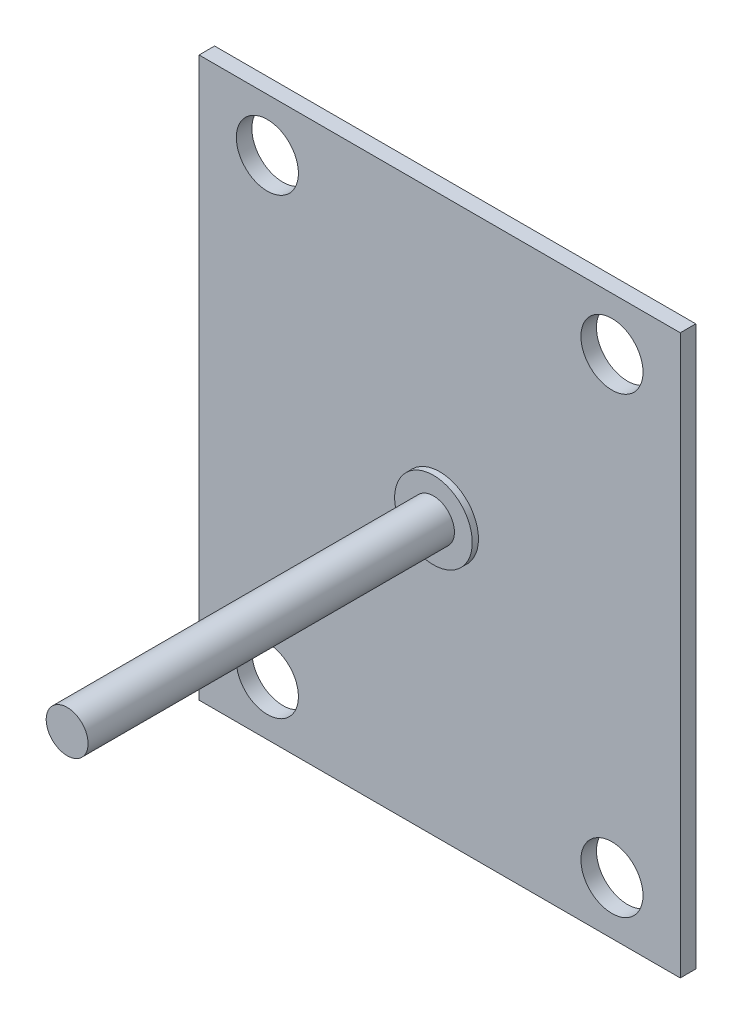
ISO-10303-21;
HEADER;
FILE_DESCRIPTION(('STEP AP214'),'2;1');
FILE_NAME('part.step','',(''),(''),'','','');
FILE_SCHEMA(('AUTOMOTIVE_DESIGN { 1 0 10303 214 1 1 1 1 }'));
ENDSEC;
DATA;
#1=APPLICATION_CONTEXT('core data for automotive mechanical design processes');
#2=APPLICATION_PROTOCOL_DEFINITION('international standard','automotive_design',2000,#1);
#3=PRODUCT_CONTEXT('',#1,'mechanical');
#4=PRODUCT('Part','Part','',(#3));
#5=PRODUCT_RELATED_PRODUCT_CATEGORY('part','',(#4));
#6=PRODUCT_DEFINITION_FORMATION('','',#4);
#7=PRODUCT_DEFINITION_CONTEXT('part definition',#1,'design');
#8=PRODUCT_DEFINITION('design','',#6,#7);
#9=PRODUCT_DEFINITION_SHAPE('','',#8);
#10=(LENGTH_UNIT() NAMED_UNIT(*) SI_UNIT(.MILLI.,.METRE.));
#11=(NAMED_UNIT(*) PLANE_ANGLE_UNIT() SI_UNIT($,.RADIAN.));
#12=(NAMED_UNIT(*) SI_UNIT($,.STERADIAN.) SOLID_ANGLE_UNIT());
#13=UNCERTAINTY_MEASURE_WITH_UNIT(LENGTH_MEASURE(1.E-05),#10,'distance_accuracy_value','');
#14=(GEOMETRIC_REPRESENTATION_CONTEXT(3) GLOBAL_UNCERTAINTY_ASSIGNED_CONTEXT((#13)) GLOBAL_UNIT_ASSIGNED_CONTEXT((#10,
#11,#12)) REPRESENTATION_CONTEXT('',''));
#15=CARTESIAN_POINT('',(0.,0.,0.));
#16=DIRECTION('',(0.,0.,1.));
#17=DIRECTION('',(1.,0.,0.));
#18=AXIS2_PLACEMENT_3D('',#15,#16,#17);
#19=CARTESIAN_POINT('',(-77.5,0.,5.));
#20=DIRECTION('',(-1.,0.,0.));
#21=DIRECTION('',(0.,0.,1.));
#22=AXIS2_PLACEMENT_3D('',#19,#20,#21);
#23=PLANE('',#22);
#24=DIRECTION('',(0.,1.,0.));
#25=VECTOR('',#24,1.);
#26=CARTESIAN_POINT('',(-77.5,0.,0.));
#27=LINE('',#26,#25);
#28=CARTESIAN_POINT('',(-77.5,-90.,0.));
#29=VERTEX_POINT('',#28);
#30=CARTESIAN_POINT('',(-77.5,90.,0.));
#31=VERTEX_POINT('',#30);
#32=EDGE_CURVE('E196',#29,#31,#27,.T.);
#33=ORIENTED_EDGE('',*,*,#32,.F.);
#34=DIRECTION('',(0.,0.,-1.));
#35=VECTOR('',#34,1.);
#36=CARTESIAN_POINT('',(-77.5,-90.,5.));
#37=LINE('',#36,#35);
#38=CARTESIAN_POINT('',(-77.5,-90.,5.));
#39=VERTEX_POINT('',#38);
#40=EDGE_CURVE('E219',#39,#29,#37,.T.);
#41=ORIENTED_EDGE('',*,*,#40,.F.);
#42=DIRECTION('',(0.,1.,0.));
#43=VECTOR('',#42,1.);
#44=CARTESIAN_POINT('',(-77.5,0.,5.));
#45=LINE('',#44,#43);
#46=CARTESIAN_POINT('',(-77.5,90.,5.));
#47=VERTEX_POINT('',#46);
#48=EDGE_CURVE('E173',#39,#47,#45,.T.);
#49=ORIENTED_EDGE('',*,*,#48,.T.);
#50=DIRECTION('',(0.,0.,-1.));
#51=VECTOR('',#50,1.);
#52=CARTESIAN_POINT('',(-77.5,90.,5.));
#53=LINE('',#52,#51);
#54=EDGE_CURVE('E190',#47,#31,#53,.T.);
#55=ORIENTED_EDGE('',*,*,#54,.T.);
#56=EDGE_LOOP('',(#33,#41,#49,#55));
#57=FACE_BOUND('',#56,.T.);
#58=ADVANCED_FACE('F34',(#57),#23,.T.);
#59=CARTESIAN_POINT('',(0.,-90.,5.));
#60=DIRECTION('',(0.,-1.,0.));
#61=DIRECTION('',(1.,0.,0.));
#62=AXIS2_PLACEMENT_3D('',#59,#60,#61);
#63=PLANE('',#62);
#64=DIRECTION('',(-1.,0.,0.));
#65=VECTOR('',#64,1.);
#66=CARTESIAN_POINT('',(0.,-90.,0.));
#67=LINE('',#66,#65);
#68=CARTESIAN_POINT('',(77.5,-90.,0.));
#69=VERTEX_POINT('',#68);
#70=EDGE_CURVE('E199',#69,#29,#67,.T.);
#71=ORIENTED_EDGE('',*,*,#70,.F.);
#72=DIRECTION('',(0.,0.,-1.));
#73=VECTOR('',#72,1.);
#74=CARTESIAN_POINT('',(77.5,-90.,5.));
#75=LINE('',#74,#73);
#76=CARTESIAN_POINT('',(77.5,-90.,5.));
#77=VERTEX_POINT('',#76);
#78=EDGE_CURVE('E217',#77,#69,#75,.T.);
#79=ORIENTED_EDGE('',*,*,#78,.F.);
#80=DIRECTION('',(-1.,0.,0.));
#81=VECTOR('',#80,1.);
#82=CARTESIAN_POINT('',(0.,-90.,5.));
#83=LINE('',#82,#81);
#84=EDGE_CURVE('E176',#77,#39,#83,.T.);
#85=ORIENTED_EDGE('',*,*,#84,.T.);
#86=ORIENTED_EDGE('',*,*,#40,.T.);
#87=EDGE_LOOP('',(#71,#79,#85,#86));
#88=FACE_BOUND('',#87,.T.);
#89=ADVANCED_FACE('F254',(#88),#63,.T.);
#90=CARTESIAN_POINT('',(77.5,0.,5.));
#91=DIRECTION('',(-1.,0.,0.));
#92=DIRECTION('',(0.,0.,1.));
#93=AXIS2_PLACEMENT_3D('',#90,#91,#92);
#94=PLANE('',#93);
#95=DIRECTION('',(0.,1.,0.));
#96=VECTOR('',#95,1.);
#97=CARTESIAN_POINT('',(77.5,0.,0.));
#98=LINE('',#97,#96);
#99=CARTESIAN_POINT('',(77.5,90.,0.));
#100=VERTEX_POINT('',#99);
#101=EDGE_CURVE('E202',#69,#100,#98,.T.);
#102=ORIENTED_EDGE('',*,*,#101,.T.);
#103=DIRECTION('',(0.,0.,-1.));
#104=VECTOR('',#103,1.);
#105=CARTESIAN_POINT('',(77.5,90.,5.));
#106=LINE('',#105,#104);
#107=CARTESIAN_POINT('',(77.5,90.,5.));
#108=VERTEX_POINT('',#107);
#109=EDGE_CURVE('E214',#108,#100,#106,.T.);
#110=ORIENTED_EDGE('',*,*,#109,.F.);
#111=DIRECTION('',(0.,1.,0.));
#112=VECTOR('',#111,1.);
#113=CARTESIAN_POINT('',(77.5,0.,5.));
#114=LINE('',#113,#112);
#115=EDGE_CURVE('E179',#77,#108,#114,.T.);
#116=ORIENTED_EDGE('',*,*,#115,.F.);
#117=ORIENTED_EDGE('',*,*,#78,.T.);
#118=EDGE_LOOP('',(#102,#110,#116,#117));
#119=FACE_BOUND('',#118,.T.);
#120=ADVANCED_FACE('F260',(#119),#94,.F.);
#121=CARTESIAN_POINT('',(55.5000000000013,72.9999999999995,5.));
#122=DIRECTION('',(0.,0.,-1.));
#123=DIRECTION('',(-1.,0.,0.));
#124=AXIS2_PLACEMENT_3D('',#121,#122,#123);
#125=CYLINDRICAL_SURFACE('',#124,10.);
#126=CARTESIAN_POINT('',(55.5000000000013,72.9999999999995,5.));
#127=DIRECTION('',(0.,0.,1.));
#128=DIRECTION('',(1.,0.,0.));
#129=AXIS2_PLACEMENT_3D('',#126,#127,#128);
#130=CIRCLE('',#129,10.);
#131=CARTESIAN_POINT('',(65.5000000000013,72.9999999999995,5.));
#132=VERTEX_POINT('',#131);
#133=EDGE_CURVE('E184',#132,#132,#130,.T.);
#134=ORIENTED_EDGE('',*,*,#133,.T.);
#135=EDGE_LOOP('',(#134));
#136=FACE_BOUND('',#135,.T.);
#137=CARTESIAN_POINT('',(55.5000000000013,72.9999999999995,0.));
#138=DIRECTION('',(0.,0.,1.));
#139=DIRECTION('',(1.,0.,0.));
#140=AXIS2_PLACEMENT_3D('',#137,#138,#139);
#141=CIRCLE('',#140,10.);
#142=CARTESIAN_POINT('',(65.5000000000013,72.9999999999995,0.));
#143=VERTEX_POINT('',#142);
#144=EDGE_CURVE('E208',#143,#143,#141,.T.);
#145=ORIENTED_EDGE('',*,*,#144,.F.);
#146=EDGE_LOOP('',(#145));
#147=FACE_BOUND('',#146,.T.);
#148=ADVANCED_FACE('F275',(#136,#147),#125,.F.);
#149=CARTESIAN_POINT('',(0.,90.,5.));
#150=DIRECTION('',(0.,-1.,0.));
#151=DIRECTION('',(1.,0.,0.));
#152=AXIS2_PLACEMENT_3D('',#149,#150,#151);
#153=PLANE('',#152);
#154=DIRECTION('',(-1.,0.,0.));
#155=VECTOR('',#154,1.);
#156=CARTESIAN_POINT('',(0.,90.,0.));
#157=LINE('',#156,#155);
#158=EDGE_CURVE('E205',#100,#31,#157,.T.);
#159=ORIENTED_EDGE('',*,*,#158,.T.);
#160=ORIENTED_EDGE('',*,*,#54,.F.);
#161=DIRECTION('',(-1.,0.,0.));
#162=VECTOR('',#161,1.);
#163=CARTESIAN_POINT('',(0.,90.,5.));
#164=LINE('',#163,#162);
#165=EDGE_CURVE('E182',#108,#47,#164,.T.);
#166=ORIENTED_EDGE('',*,*,#165,.F.);
#167=ORIENTED_EDGE('',*,*,#109,.T.);
#168=EDGE_LOOP('',(#159,#160,#166,#167));
#169=FACE_BOUND('',#168,.T.);
#170=ADVANCED_FACE('F267',(#169),#153,.F.);
#171=CARTESIAN_POINT('',(-55.5,-73.,5.));
#172=DIRECTION('',(0.,0.,-1.));
#173=DIRECTION('',(-1.,0.,0.));
#174=AXIS2_PLACEMENT_3D('',#171,#172,#173);
#175=CYLINDRICAL_SURFACE('',#174,10.);
#176=CARTESIAN_POINT('',(-55.5,-73.,5.));
#177=DIRECTION('',(0.,0.,1.));
#178=DIRECTION('',(1.,0.,0.));
#179=AXIS2_PLACEMENT_3D('',#176,#177,#178);
#180=CIRCLE('',#179,10.);
#181=CARTESIAN_POINT('',(-45.5,-73.,5.));
#182=VERTEX_POINT('',#181);
#183=EDGE_CURVE('E166',#182,#182,#180,.T.);
#184=ORIENTED_EDGE('',*,*,#183,.T.);
#185=EDGE_LOOP('',(#184));
#186=FACE_BOUND('',#185,.T.);
#187=CARTESIAN_POINT('',(-55.5,-73.,0.));
#188=DIRECTION('',(0.,0.,1.));
#189=DIRECTION('',(1.,0.,0.));
#190=AXIS2_PLACEMENT_3D('',#187,#188,#189);
#191=CIRCLE('',#190,10.);
#192=CARTESIAN_POINT('',(-45.5,-73.,0.));
#193=VERTEX_POINT('',#192);
#194=EDGE_CURVE('E193',#193,#193,#191,.T.);
#195=ORIENTED_EDGE('',*,*,#194,.F.);
#196=EDGE_LOOP('',(#195));
#197=FACE_BOUND('',#196,.T.);
#198=ADVANCED_FACE('F265',(#186,#197),#175,.F.);
#199=CARTESIAN_POINT('',(55.5000000000013,-72.9999999999995,5.));
#200=DIRECTION('',(0.,0.,-1.));
#201=DIRECTION('',(-1.,0.,0.));
#202=AXIS2_PLACEMENT_3D('',#199,#200,#201);
#203=CYLINDRICAL_SURFACE('',#202,10.);
#204=CARTESIAN_POINT('',(55.5000000000013,-72.9999999999995,5.));
#205=DIRECTION('',(0.,0.,1.));
#206=DIRECTION('',(1.,0.,0.));
#207=AXIS2_PLACEMENT_3D('',#204,#205,#206);
#208=CIRCLE('',#207,10.);
#209=CARTESIAN_POINT('',(65.5000000000013,-72.9999999999995,5.));
#210=VERTEX_POINT('',#209);
#211=EDGE_CURVE('E163',#210,#210,#208,.F.);
#212=ORIENTED_EDGE('',*,*,#211,.F.);
#213=EDGE_LOOP('',(#212));
#214=FACE_BOUND('',#213,.T.);
#215=CARTESIAN_POINT('',(55.5000000000013,-72.9999999999995,0.));
#216=DIRECTION('',(0.,0.,1.));
#217=DIRECTION('',(1.,0.,0.));
#218=AXIS2_PLACEMENT_3D('',#215,#216,#217);
#219=CIRCLE('',#218,10.);
#220=CARTESIAN_POINT('',(65.5000000000013,-72.9999999999995,0.));
#221=VERTEX_POINT('',#220);
#222=EDGE_CURVE('E162',#221,#221,#219,.F.);
#223=ORIENTED_EDGE('',*,*,#222,.T.);
#224=EDGE_LOOP('',(#223));
#225=FACE_BOUND('',#224,.T.);
#226=ADVANCED_FACE('F36',(#214,#225),#203,.F.);
#227=CARTESIAN_POINT('',(-55.5,73.,5.));
#228=DIRECTION('',(0.,0.,-1.));
#229=DIRECTION('',(-1.,0.,0.));
#230=AXIS2_PLACEMENT_3D('',#227,#228,#229);
#231=CYLINDRICAL_SURFACE('',#230,10.);
#232=CARTESIAN_POINT('',(-55.5,73.,5.));
#233=DIRECTION('',(0.,0.,1.));
#234=DIRECTION('',(1.,0.,0.));
#235=AXIS2_PLACEMENT_3D('',#232,#233,#234);
#236=CIRCLE('',#235,10.);
#237=CARTESIAN_POINT('',(-45.5,73.,5.));
#238=VERTEX_POINT('',#237);
#239=EDGE_CURVE('E187',#238,#238,#236,.F.);
#240=ORIENTED_EDGE('',*,*,#239,.F.);
#241=EDGE_LOOP('',(#240));
#242=FACE_BOUND('',#241,.T.);
#243=CARTESIAN_POINT('',(-55.5,73.,0.));
#244=DIRECTION('',(0.,0.,1.));
#245=DIRECTION('',(1.,0.,0.));
#246=AXIS2_PLACEMENT_3D('',#243,#244,#245);
#247=CIRCLE('',#246,10.);
#248=CARTESIAN_POINT('',(-45.5,73.,0.));
#249=VERTEX_POINT('',#248);
#250=EDGE_CURVE('E167',#249,#249,#247,.F.);
#251=ORIENTED_EDGE('',*,*,#250,.T.);
#252=EDGE_LOOP('',(#251));
#253=FACE_BOUND('',#252,.T.);
#254=ADVANCED_FACE('F273',(#242,#253),#231,.F.);
#255=CARTESIAN_POINT('',(0.,0.,5.));
#256=DIRECTION('',(0.,0.,1.));
#257=DIRECTION('',(1.,0.,0.));
#258=AXIS2_PLACEMENT_3D('',#255,#256,#257);
#259=PLANE('',#258);
#260=ORIENTED_EDGE('',*,*,#211,.T.);
#261=EDGE_LOOP('',(#260));
#262=FACE_BOUND('',#261,.T.);
#263=ORIENTED_EDGE('',*,*,#183,.F.);
#264=EDGE_LOOP('',(#263));
#265=FACE_BOUND('',#264,.T.);
#266=CARTESIAN_POINT('',(0.,0.,5.));
#267=DIRECTION('',(0.,0.,1.));
#268=DIRECTION('',(1.,0.,0.));
#269=AXIS2_PLACEMENT_3D('',#266,#267,#268);
#270=CIRCLE('',#269,12.5);
#271=CARTESIAN_POINT('',(12.5,0.,5.));
#272=VERTEX_POINT('',#271);
#273=EDGE_CURVE('E170',#272,#272,#270,.T.);
#274=ORIENTED_EDGE('',*,*,#273,.F.);
#275=EDGE_LOOP('',(#274));
#276=FACE_BOUND('',#275,.T.);
#277=ORIENTED_EDGE('',*,*,#48,.F.);
#278=ORIENTED_EDGE('',*,*,#84,.F.);
#279=ORIENTED_EDGE('',*,*,#115,.T.);
#280=ORIENTED_EDGE('',*,*,#165,.T.);
#281=EDGE_LOOP('',(#277,#278,#279,#280));
#282=FACE_BOUND('',#281,.T.);
#283=ORIENTED_EDGE('',*,*,#133,.F.);
#284=EDGE_LOOP('',(#283));
#285=FACE_BOUND('',#284,.T.);
#286=ORIENTED_EDGE('',*,*,#239,.T.);
#287=EDGE_LOOP('',(#286));
#288=FACE_BOUND('',#287,.T.);
#289=ADVANCED_FACE('F286',(#262,#265,#276,#282,#285,#288),#259,.T.);
#290=CARTESIAN_POINT('',(0.,0.,0.));
#291=DIRECTION('',(0.,0.,1.));
#292=DIRECTION('',(1.,0.,0.));
#293=AXIS2_PLACEMENT_3D('',#290,#291,#292);
#294=PLANE('',#293);
#295=CARTESIAN_POINT('',(0.,0.,0.));
#296=DIRECTION('',(0.,0.,1.));
#297=DIRECTION('',(1.,0.,0.));
#298=AXIS2_PLACEMENT_3D('',#295,#296,#297);
#299=CIRCLE('',#298,5.75);
#300=CARTESIAN_POINT('',(5.75,0.,0.));
#301=VERTEX_POINT('',#300);
#302=EDGE_CURVE('E147',#301,#301,#299,.T.);
#303=ORIENTED_EDGE('',*,*,#302,.T.);
#304=EDGE_LOOP('',(#303));
#305=FACE_BOUND('',#304,.T.);
#306=ORIENTED_EDGE('',*,*,#222,.F.);
#307=EDGE_LOOP('',(#306));
#308=FACE_BOUND('',#307,.T.);
#309=ORIENTED_EDGE('',*,*,#194,.T.);
#310=EDGE_LOOP('',(#309));
#311=FACE_BOUND('',#310,.T.);
#312=ORIENTED_EDGE('',*,*,#32,.T.);
#313=ORIENTED_EDGE('',*,*,#158,.F.);
#314=ORIENTED_EDGE('',*,*,#101,.F.);
#315=ORIENTED_EDGE('',*,*,#70,.T.);
#316=EDGE_LOOP('',(#312,#313,#314,#315));
#317=FACE_BOUND('',#316,.T.);
#318=ORIENTED_EDGE('',*,*,#144,.T.);
#319=EDGE_LOOP('',(#318));
#320=FACE_BOUND('',#319,.T.);
#321=ORIENTED_EDGE('',*,*,#250,.F.);
#322=EDGE_LOOP('',(#321));
#323=FACE_BOUND('',#322,.T.);
#324=ADVANCED_FACE('F282',(#305,#308,#311,#317,#320,#323),#294,.F.);
#325=CARTESIAN_POINT('',(0.,0.,7.));
#326=DIRECTION('',(0.,0.,-1.));
#327=DIRECTION('',(-1.,0.,0.));
#328=AXIS2_PLACEMENT_3D('',#325,#326,#327);
#329=CYLINDRICAL_SURFACE('',#328,12.5);
#330=ORIENTED_EDGE('',*,*,#273,.T.);
#331=EDGE_LOOP('',(#330));
#332=FACE_BOUND('',#331,.T.);
#333=CARTESIAN_POINT('',(0.,0.,7.));
#334=DIRECTION('',(0.,0.,1.));
#335=DIRECTION('',(1.,0.,0.));
#336=AXIS2_PLACEMENT_3D('',#333,#334,#335);
#337=CIRCLE('',#336,12.5);
#338=CARTESIAN_POINT('',(12.5,0.,7.));
#339=VERTEX_POINT('',#338);
#340=EDGE_CURVE('E159',#339,#339,#337,.T.);
#341=ORIENTED_EDGE('',*,*,#340,.F.);
#342=EDGE_LOOP('',(#341));
#343=FACE_BOUND('',#342,.T.);
#344=ADVANCED_FACE('F285',(#332,#343),#329,.T.);
#345=CARTESIAN_POINT('',(0.,0.,7.));
#346=DIRECTION('',(0.,0.,1.));
#347=DIRECTION('',(1.,0.,0.));
#348=AXIS2_PLACEMENT_3D('',#345,#346,#347);
#349=PLANE('',#348);
#350=CARTESIAN_POINT('',(0.,0.,7.));
#351=DIRECTION('',(0.,0.,1.));
#352=DIRECTION('',(1.,0.,0.));
#353=AXIS2_PLACEMENT_3D('',#350,#351,#352);
#354=CIRCLE('',#353,6.75);
#355=CARTESIAN_POINT('',(6.75,0.,7.));
#356=VERTEX_POINT('',#355);
#357=EDGE_CURVE('E156',#356,#356,#354,.T.);
#358=ORIENTED_EDGE('',*,*,#357,.F.);
#359=EDGE_LOOP('',(#358));
#360=FACE_BOUND('',#359,.T.);
#361=ORIENTED_EDGE('',*,*,#340,.T.);
#362=EDGE_LOOP('',(#361));
#363=FACE_BOUND('',#362,.T.);
#364=ADVANCED_FACE('F362',(#360,#363),#349,.T.);
#365=CARTESIAN_POINT('',(0.,0.,125.));
#366=DIRECTION('',(0.,0.,1.));
#367=DIRECTION('',(1.,0.,0.));
#368=AXIS2_PLACEMENT_3D('',#365,#366,#367);
#369=PLANE('',#368);
#370=CARTESIAN_POINT('',(0.,0.,125.));
#371=DIRECTION('',(0.,0.,1.));
#372=DIRECTION('',(1.,0.,0.));
#373=AXIS2_PLACEMENT_3D('',#370,#371,#372);
#374=CIRCLE('',#373,6.75);
#375=CARTESIAN_POINT('',(6.75,0.,125.));
#376=VERTEX_POINT('',#375);
#377=EDGE_CURVE('E151',#376,#376,#374,.T.);
#378=ORIENTED_EDGE('',*,*,#377,.T.);
#379=EDGE_LOOP('',(#378));
#380=FACE_BOUND('',#379,.T.);
#381=ADVANCED_FACE('F373',(#380),#369,.T.);
#382=CARTESIAN_POINT('',(0.,0.,125.));
#383=DIRECTION('',(0.,0.,-1.));
#384=DIRECTION('',(-1.,0.,0.));
#385=AXIS2_PLACEMENT_3D('',#382,#383,#384);
#386=CYLINDRICAL_SURFACE('',#385,6.75);
#387=DIRECTION('',(0.,0.,-1.));
#388=VECTOR('',#387,1.);
#389=CARTESIAN_POINT('',(-3.,-6.04669331122391,125.));
#390=LINE('',#389,#388);
#391=CARTESIAN_POINT('',(-3.,-6.04669331122391,95.));
#392=VERTEX_POINT('',#391);
#393=CARTESIAN_POINT('',(-3.,-6.04669331122391,15.));
#394=VERTEX_POINT('',#393);
#395=EDGE_CURVE('E11',#392,#394,#390,.T.);
#396=ORIENTED_EDGE('',*,*,#395,.F.);
#397=CARTESIAN_POINT('',(0.,0.,95.));
#398=DIRECTION('',(0.,0.,1.));
#399=DIRECTION('',(1.,0.,0.));
#400=AXIS2_PLACEMENT_3D('',#397,#398,#399);
#401=CIRCLE('',#400,6.75);
#402=CARTESIAN_POINT('',(3.,-6.04669331122391,95.));
#403=VERTEX_POINT('',#402);
#404=EDGE_CURVE('E145',#392,#403,#401,.T.);
#405=ORIENTED_EDGE('',*,*,#404,.T.);
#406=DIRECTION('',(0.,0.,-1.));
#407=VECTOR('',#406,1.);
#408=CARTESIAN_POINT('',(3.,-6.04669331122391,125.));
#409=LINE('',#408,#407);
#410=CARTESIAN_POINT('',(3.,-6.04669331122391,15.));
#411=VERTEX_POINT('',#410);
#412=EDGE_CURVE('E42',#411,#403,#409,.F.);
#413=ORIENTED_EDGE('',*,*,#412,.F.);
#414=CARTESIAN_POINT('',(0.,0.,15.));
#415=DIRECTION('',(0.,0.,1.));
#416=DIRECTION('',(1.,0.,0.));
#417=AXIS2_PLACEMENT_3D('',#414,#415,#416);
#418=CIRCLE('',#417,6.75);
#419=EDGE_CURVE('E126',#394,#411,#418,.T.);
#420=ORIENTED_EDGE('',*,*,#419,.F.);
#421=EDGE_LOOP('',(#396,#405,#413,#420));
#422=FACE_BOUND('',#421,.T.);
#423=ORIENTED_EDGE('',*,*,#357,.T.);
#424=EDGE_LOOP('',(#423));
#425=FACE_BOUND('',#424,.T.);
#426=ORIENTED_EDGE('',*,*,#377,.F.);
#427=EDGE_LOOP('',(#426));
#428=FACE_BOUND('',#427,.T.);
#429=ADVANCED_FACE('F242',(#422,#425,#428),#386,.T.);
#430=CARTESIAN_POINT('',(0.,0.,120.));
#431=DIRECTION('',(0.,0.,-1.));
#432=DIRECTION('',(-1.,0.,0.));
#433=AXIS2_PLACEMENT_3D('',#430,#431,#432);
#434=CYLINDRICAL_SURFACE('',#433,5.75);
#435=CARTESIAN_POINT('',(0.,0.,95.));
#436=DIRECTION('',(0.,0.,1.));
#437=DIRECTION('',(1.,0.,0.));
#438=AXIS2_PLACEMENT_3D('',#435,#436,#437);
#439=CIRCLE('',#438,5.75);
#440=CARTESIAN_POINT('',(-2.37019955390404,-5.23876455614042,95.));
#441=VERTEX_POINT('',#440);
#442=CARTESIAN_POINT('',(2.37019955390404,-5.23876455614042,95.));
#443=VERTEX_POINT('',#442);
#444=EDGE_CURVE('E133',#441,#443,#439,.T.);
#445=ORIENTED_EDGE('',*,*,#444,.F.);
#446=DIRECTION('',(0.,0.,-1.));
#447=VECTOR('',#446,1.);
#448=CARTESIAN_POINT('',(-2.37019955390404,-5.23876455614042,120.));
#449=LINE('',#448,#447);
#450=CARTESIAN_POINT('',(-2.37019955390404,-5.23876455614042,15.));
#451=VERTEX_POINT('',#450);
#452=EDGE_CURVE('E226',#441,#451,#449,.T.);
#453=ORIENTED_EDGE('',*,*,#452,.T.);
#454=CARTESIAN_POINT('',(0.,0.,15.));
#455=DIRECTION('',(0.,0.,1.));
#456=DIRECTION('',(1.,0.,0.));
#457=AXIS2_PLACEMENT_3D('',#454,#455,#456);
#458=CIRCLE('',#457,5.75);
#459=CARTESIAN_POINT('',(2.37019955390404,-5.23876455614042,15.));
#460=VERTEX_POINT('',#459);
#461=EDGE_CURVE('E221',#451,#460,#458,.T.);
#462=ORIENTED_EDGE('',*,*,#461,.T.);
#463=DIRECTION('',(0.,0.,-1.));
#464=VECTOR('',#463,1.);
#465=CARTESIAN_POINT('',(2.37019955390404,-5.23876455614042,120.));
#466=LINE('',#465,#464);
#467=EDGE_CURVE('E224',#460,#443,#466,.F.);
#468=ORIENTED_EDGE('',*,*,#467,.T.);
#469=EDGE_LOOP('',(#445,#453,#462,#468));
#470=FACE_BOUND('',#469,.T.);
#471=CARTESIAN_POINT('',(0.,0.,120.));
#472=DIRECTION('',(0.,0.,1.));
#473=DIRECTION('',(1.,0.,0.));
#474=AXIS2_PLACEMENT_3D('',#471,#472,#473);
#475=CIRCLE('',#474,5.75);
#476=CARTESIAN_POINT('',(5.75,0.,120.));
#477=VERTEX_POINT('',#476);
#478=EDGE_CURVE('E148',#477,#477,#475,.T.);
#479=ORIENTED_EDGE('',*,*,#478,.T.);
#480=EDGE_LOOP('',(#479));
#481=FACE_BOUND('',#480,.T.);
#482=ORIENTED_EDGE('',*,*,#302,.F.);
#483=EDGE_LOOP('',(#482));
#484=FACE_BOUND('',#483,.T.);
#485=ADVANCED_FACE('F230',(#470,#481,#484),#434,.F.);
#486=CARTESIAN_POINT('',(0.,0.,120.));
#487=DIRECTION('',(0.,0.,1.));
#488=DIRECTION('',(1.,0.,0.));
#489=AXIS2_PLACEMENT_3D('',#486,#487,#488);
#490=PLANE('',#489);
#491=ORIENTED_EDGE('',*,*,#478,.F.);
#492=EDGE_LOOP('',(#491));
#493=FACE_BOUND('',#492,.T.);
#494=ADVANCED_FACE('F396',(#493),#490,.F.);
#495=CARTESIAN_POINT('',(-3.,-8.26123544385958,95.));
#496=DIRECTION('',(1.,0.,0.));
#497=DIRECTION('',(0.,0.,-1.));
#498=AXIS2_PLACEMENT_3D('',#495,#496,#497);
#499=PLANE('',#498);
#500=ORIENTED_EDGE('',*,*,#395,.T.);
#501=DIRECTION('',(0.,-1.,0.));
#502=VECTOR('',#501,1.);
#503=CARTESIAN_POINT('',(-3.,-8.26123544385958,15.));
#504=LINE('',#503,#502);
#505=CARTESIAN_POINT('',(-3.,-5.23876455614042,15.));
#506=VERTEX_POINT('',#505);
#507=EDGE_CURVE('E49',#506,#394,#504,.T.);
#508=ORIENTED_EDGE('',*,*,#507,.F.);
#509=DIRECTION('',(0.,0.,-1.));
#510=VECTOR('',#509,1.);
#511=CARTESIAN_POINT('',(-3.,-5.23876455614042,95.));
#512=LINE('',#511,#510);
#513=CARTESIAN_POINT('',(-3.,-5.23876455614042,95.));
#514=VERTEX_POINT('',#513);
#515=EDGE_CURVE('E127',#514,#506,#512,.T.);
#516=ORIENTED_EDGE('',*,*,#515,.F.);
#517=DIRECTION('',(0.,-1.,0.));
#518=VECTOR('',#517,1.);
#519=CARTESIAN_POINT('',(-3.,-8.26123544385958,95.));
#520=LINE('',#519,#518);
#521=EDGE_CURVE('E119',#514,#392,#520,.T.);
#522=ORIENTED_EDGE('',*,*,#521,.T.);
#523=EDGE_LOOP('',(#500,#508,#516,#522));
#524=FACE_BOUND('',#523,.T.);
#525=ADVANCED_FACE('F239',(#524),#499,.T.);
#526=CARTESIAN_POINT('',(3.,-8.26123544385958,95.));
#527=DIRECTION('',(-1.,0.,0.));
#528=DIRECTION('',(0.,0.,1.));
#529=AXIS2_PLACEMENT_3D('',#526,#527,#528);
#530=PLANE('',#529);
#531=ORIENTED_EDGE('',*,*,#412,.T.);
#532=DIRECTION('',(0.,1.,0.));
#533=VECTOR('',#532,1.);
#534=CARTESIAN_POINT('',(3.,-8.26123544385958,95.));
#535=LINE('',#534,#533);
#536=CARTESIAN_POINT('',(3.,-5.23876455614042,95.));
#537=VERTEX_POINT('',#536);
#538=EDGE_CURVE('E109',#403,#537,#535,.T.);
#539=ORIENTED_EDGE('',*,*,#538,.T.);
#540=DIRECTION('',(0.,0.,-1.));
#541=VECTOR('',#540,1.);
#542=CARTESIAN_POINT('',(3.,-5.23876455614042,95.));
#543=LINE('',#542,#541);
#544=CARTESIAN_POINT('',(3.,-5.23876455614042,15.));
#545=VERTEX_POINT('',#544);
#546=EDGE_CURVE('E113',#537,#545,#543,.T.);
#547=ORIENTED_EDGE('',*,*,#546,.T.);
#548=DIRECTION('',(0.,1.,0.));
#549=VECTOR('',#548,1.);
#550=CARTESIAN_POINT('',(3.,-8.26123544385958,15.));
#551=LINE('',#550,#549);
#552=EDGE_CURVE('E140',#411,#545,#551,.T.);
#553=ORIENTED_EDGE('',*,*,#552,.F.);
#554=EDGE_LOOP('',(#531,#539,#547,#553));
#555=FACE_BOUND('',#554,.T.);
#556=ADVANCED_FACE('F111',(#555),#530,.T.);
#557=CARTESIAN_POINT('',(3.,-5.23876455614042,95.));
#558=DIRECTION('',(0.,-1.,0.));
#559=DIRECTION('',(1.,0.,0.));
#560=AXIS2_PLACEMENT_3D('',#557,#558,#559);
#561=PLANE('',#560);
#562=DIRECTION('',(-1.,0.,0.));
#563=VECTOR('',#562,1.);
#564=CARTESIAN_POINT('',(3.,-5.23876455614042,95.));
#565=LINE('',#564,#563);
#566=EDGE_CURVE('E118',#441,#514,#565,.T.);
#567=ORIENTED_EDGE('',*,*,#566,.T.);
#568=ORIENTED_EDGE('',*,*,#515,.T.);
#569=DIRECTION('',(-1.,0.,0.));
#570=VECTOR('',#569,1.);
#571=CARTESIAN_POINT('',(3.,-5.23876455614042,15.));
#572=LINE('',#571,#570);
#573=EDGE_CURVE('E142',#451,#506,#572,.T.);
#574=ORIENTED_EDGE('',*,*,#573,.F.);
#575=ORIENTED_EDGE('',*,*,#452,.F.);
#576=EDGE_LOOP('',(#567,#568,#574,#575));
#577=FACE_BOUND('',#576,.T.);
#578=ADVANCED_FACE('F234',(#577),#561,.T.);
#579=CARTESIAN_POINT('',(0.,0.,95.));
#580=DIRECTION('',(0.,0.,1.));
#581=DIRECTION('',(1.,0.,0.));
#582=AXIS2_PLACEMENT_3D('',#579,#580,#581);
#583=PLANE('',#582);
#584=ORIENTED_EDGE('',*,*,#521,.F.);
#585=ORIENTED_EDGE('',*,*,#566,.F.);
#586=ORIENTED_EDGE('',*,*,#444,.T.);
#587=EDGE_CURVE('E124',#537,#443,#565,.T.);
#588=ORIENTED_EDGE('',*,*,#587,.F.);
#589=ORIENTED_EDGE('',*,*,#538,.F.);
#590=ORIENTED_EDGE('',*,*,#404,.F.);
#591=EDGE_LOOP('',(#584,#585,#586,#588,#589,#590));
#592=FACE_BOUND('',#591,.T.);
#593=ADVANCED_FACE('F130',(#592),#583,.F.);
#594=CARTESIAN_POINT('',(0.,0.,15.));
#595=DIRECTION('',(0.,0.,1.));
#596=DIRECTION('',(1.,0.,0.));
#597=AXIS2_PLACEMENT_3D('',#594,#595,#596);
#598=PLANE('',#597);
#599=ORIENTED_EDGE('',*,*,#419,.T.);
#600=ORIENTED_EDGE('',*,*,#552,.T.);
#601=EDGE_CURVE('E55',#545,#460,#572,.T.);
#602=ORIENTED_EDGE('',*,*,#601,.T.);
#603=ORIENTED_EDGE('',*,*,#461,.F.);
#604=ORIENTED_EDGE('',*,*,#573,.T.);
#605=ORIENTED_EDGE('',*,*,#507,.T.);
#606=EDGE_LOOP('',(#599,#600,#602,#603,#604,#605));
#607=FACE_BOUND('',#606,.T.);
#608=ADVANCED_FACE('F244',(#607),#598,.T.);
#609=ORIENTED_EDGE('',*,*,#601,.F.);
#610=ORIENTED_EDGE('',*,*,#546,.F.);
#611=ORIENTED_EDGE('',*,*,#587,.T.);
#612=ORIENTED_EDGE('',*,*,#467,.F.);
#613=EDGE_LOOP('',(#609,#610,#611,#612));
#614=FACE_BOUND('',#613,.T.);
#615=ADVANCED_FACE('F123',(#614),#561,.T.);
#616=CLOSED_SHELL('',(#58,#89,#120,#148,#170,#198,#226,#254,#289,#324,#344,#364,#381,#429,#485,
#494,#525,#556,#578,#593,#608,#615));
#617=MANIFOLD_SOLID_BREP('B2',#616);
#618=ADVANCED_BREP_SHAPE_REPRESENTATION('',(#18,#617),#14);
#619=SHAPE_DEFINITION_REPRESENTATION(#9,#618);
ENDSEC;
END-ISO-10303-21;
